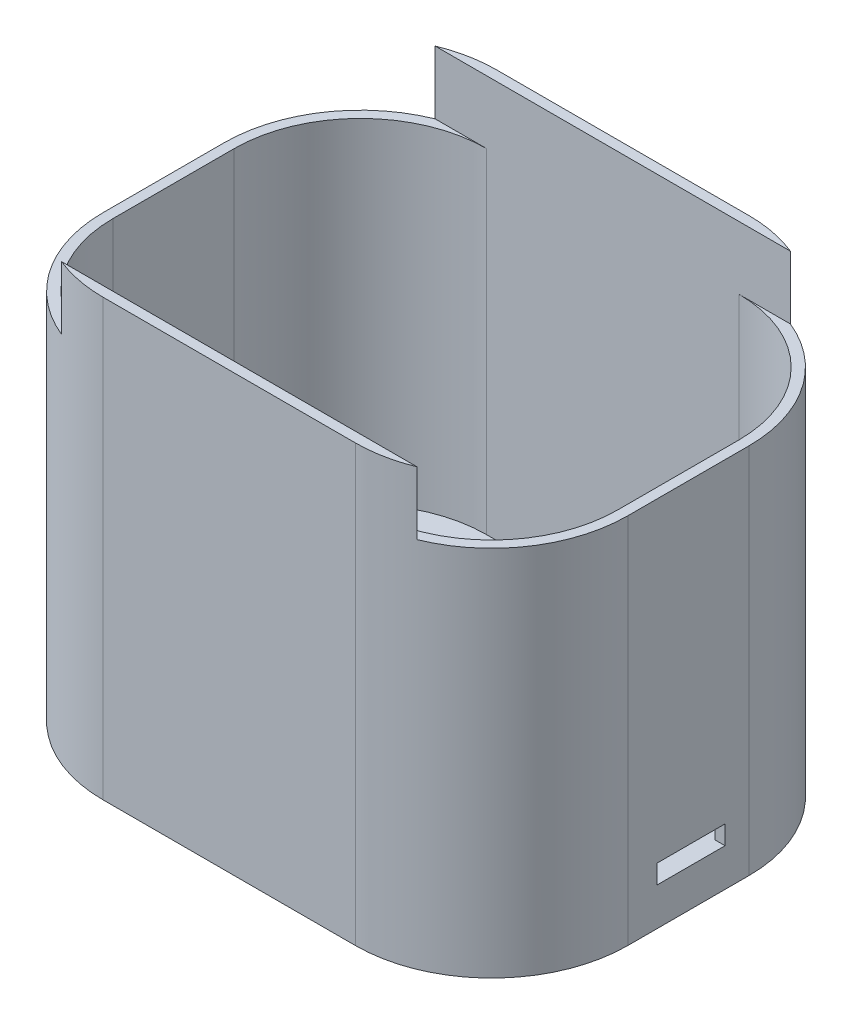
ISO-10303-21;
HEADER;
FILE_DESCRIPTION(('STEP AP214'),'2;1');
FILE_NAME('part.step','',(''),(''),'','','');
FILE_SCHEMA(('AUTOMOTIVE_DESIGN { 1 0 10303 214 1 1 1 1 }'));
ENDSEC;
DATA;
#1=APPLICATION_CONTEXT('core data for automotive mechanical design processes');
#2=APPLICATION_PROTOCOL_DEFINITION('international standard','automotive_design',2000,#1);
#3=PRODUCT_CONTEXT('',#1,'mechanical');
#4=PRODUCT('Part','Part','',(#3));
#5=PRODUCT_RELATED_PRODUCT_CATEGORY('part','',(#4));
#6=PRODUCT_DEFINITION_FORMATION('','',#4);
#7=PRODUCT_DEFINITION_CONTEXT('part definition',#1,'design');
#8=PRODUCT_DEFINITION('design','',#6,#7);
#9=PRODUCT_DEFINITION_SHAPE('','',#8);
#10=(LENGTH_UNIT() NAMED_UNIT(*) SI_UNIT(.MILLI.,.METRE.));
#11=(NAMED_UNIT(*) PLANE_ANGLE_UNIT() SI_UNIT($,.RADIAN.));
#12=(NAMED_UNIT(*) SI_UNIT($,.STERADIAN.) SOLID_ANGLE_UNIT());
#13=UNCERTAINTY_MEASURE_WITH_UNIT(LENGTH_MEASURE(1.E-05),#10,'distance_accuracy_value','');
#14=(GEOMETRIC_REPRESENTATION_CONTEXT(3) GLOBAL_UNCERTAINTY_ASSIGNED_CONTEXT((#13)) GLOBAL_UNIT_ASSIGNED_CONTEXT((#10,
#11,#12)) REPRESENTATION_CONTEXT('',''));
#15=CARTESIAN_POINT('',(0.,0.,0.));
#16=DIRECTION('',(0.,0.,1.));
#17=DIRECTION('',(1.,0.,0.));
#18=AXIS2_PLACEMENT_3D('',#15,#16,#17);
#19=CARTESIAN_POINT('',(-10.,34.5,-4.8));
#20=DIRECTION('',(0.,-1.,0.));
#21=DIRECTION('',(0.,0.,-1.));
#22=AXIS2_PLACEMENT_3D('',#19,#20,#21);
#23=CYLINDRICAL_SURFACE('',#22,10.);
#24=DIRECTION('',(0.,-1.,0.));
#25=VECTOR('',#24,1.);
#26=CARTESIAN_POINT('',(-20.,34.5,-4.8));
#27=LINE('',#26,#25);
#28=CARTESIAN_POINT('',(-20.,29.5,-4.8));
#29=VERTEX_POINT('',#28);
#30=CARTESIAN_POINT('',(-20.,3.,-4.8));
#31=VERTEX_POINT('',#30);
#32=EDGE_CURVE('E382',#29,#31,#27,.T.);
#33=ORIENTED_EDGE('',*,*,#32,.T.);
#34=CARTESIAN_POINT('',(-10.,3.,-4.8));
#35=DIRECTION('',(0.,-1.,0.));
#36=DIRECTION('',(0.,0.,-1.));
#37=AXIS2_PLACEMENT_3D('',#34,#35,#36);
#38=CIRCLE('',#37,10.);
#39=CARTESIAN_POINT('',(-10.,3.,-14.8));
#40=VERTEX_POINT('',#39);
#41=EDGE_CURVE('E296',#31,#40,#38,.T.);
#42=ORIENTED_EDGE('',*,*,#41,.T.);
#43=DIRECTION('',(0.,-1.,0.));
#44=VECTOR('',#43,1.);
#45=CARTESIAN_POINT('',(-10.,34.5,-14.8));
#46=LINE('',#45,#44);
#47=CARTESIAN_POINT('',(-10.,29.5,-14.8));
#48=VERTEX_POINT('',#47);
#49=EDGE_CURVE('E361',#48,#40,#46,.T.);
#50=ORIENTED_EDGE('',*,*,#49,.F.);
#51=CARTESIAN_POINT('',(-10.,29.5,-4.8));
#52=DIRECTION('',(0.,-1.,0.));
#53=DIRECTION('',(0.,0.,-1.));
#54=AXIS2_PLACEMENT_3D('',#51,#52,#53);
#55=CIRCLE('',#54,10.);
#56=EDGE_CURVE('E331',#29,#48,#55,.T.);
#57=ORIENTED_EDGE('',*,*,#56,.F.);
#58=EDGE_LOOP('',(#33,#42,#50,#57));
#59=FACE_BOUND('',#58,.T.);
#60=ADVANCED_FACE('F37',(#59),#23,.F.);
#61=CARTESIAN_POINT('',(-20.,34.5,4.8));
#62=DIRECTION('',(1.,0.,0.));
#63=DIRECTION('',(0.,0.,-1.));
#64=AXIS2_PLACEMENT_3D('',#61,#62,#63);
#65=PLANE('',#64);
#66=DIRECTION('',(0.,1.,0.));
#67=VECTOR('',#66,1.);
#68=CARTESIAN_POINT('',(-20.,34.5,-2.89999999999999));
#69=LINE('',#68,#67);
#70=CARTESIAN_POINT('',(-20.,3.,-2.89999999999999));
#71=VERTEX_POINT('',#70);
#72=CARTESIAN_POINT('',(-20.,4.5,-2.90000000000001));
#73=VERTEX_POINT('',#72);
#74=EDGE_CURVE('E228',#71,#73,#69,.T.);
#75=ORIENTED_EDGE('',*,*,#74,.F.);
#76=DIRECTION('',(0.,0.,-1.));
#77=VECTOR('',#76,1.);
#78=CARTESIAN_POINT('',(-20.,3.,-4.8));
#79=LINE('',#78,#77);
#80=EDGE_CURVE('E292',#71,#31,#79,.T.);
#81=ORIENTED_EDGE('',*,*,#80,.T.);
#82=ORIENTED_EDGE('',*,*,#32,.F.);
#83=DIRECTION('',(0.,0.,-1.));
#84=VECTOR('',#83,1.);
#85=CARTESIAN_POINT('',(-20.,29.5,4.8));
#86=LINE('',#85,#84);
#87=CARTESIAN_POINT('',(-20.,29.5,4.8));
#88=VERTEX_POINT('',#87);
#89=EDGE_CURVE('E329',#88,#29,#86,.T.);
#90=ORIENTED_EDGE('',*,*,#89,.F.);
#91=DIRECTION('',(0.,-1.,0.));
#92=VECTOR('',#91,1.);
#93=CARTESIAN_POINT('',(-20.,34.5,4.8));
#94=LINE('',#93,#92);
#95=CARTESIAN_POINT('',(-20.,3.,4.8));
#96=VERTEX_POINT('',#95);
#97=EDGE_CURVE('E379',#88,#96,#94,.T.);
#98=ORIENTED_EDGE('',*,*,#97,.T.);
#99=CARTESIAN_POINT('',(-20.,3.,2.50000000000001));
#100=VERTEX_POINT('',#99);
#101=EDGE_CURVE('E293',#96,#100,#79,.T.);
#102=ORIENTED_EDGE('',*,*,#101,.T.);
#103=DIRECTION('',(0.,-1.,0.));
#104=VECTOR('',#103,1.);
#105=CARTESIAN_POINT('',(-20.,34.5,2.50000000000001));
#106=LINE('',#105,#104);
#107=CARTESIAN_POINT('',(-20.,4.5,2.50000000000001));
#108=VERTEX_POINT('',#107);
#109=EDGE_CURVE('E274',#108,#100,#106,.T.);
#110=ORIENTED_EDGE('',*,*,#109,.F.);
#111=DIRECTION('',(0.,0.,1.));
#112=VECTOR('',#111,1.);
#113=CARTESIAN_POINT('',(-20.,4.5,4.8));
#114=LINE('',#113,#112);
#115=EDGE_CURVE('E281',#73,#108,#114,.T.);
#116=ORIENTED_EDGE('',*,*,#115,.F.);
#117=EDGE_LOOP('',(#75,#81,#82,#90,#98,#102,#110,#116));
#118=FACE_BOUND('',#117,.T.);
#119=ADVANCED_FACE('F520',(#118),#65,.T.);
#120=CARTESIAN_POINT('',(-10.,34.5,4.8));
#121=DIRECTION('',(0.,-1.,0.));
#122=DIRECTION('',(0.,0.,-1.));
#123=AXIS2_PLACEMENT_3D('',#120,#121,#122);
#124=CYLINDRICAL_SURFACE('',#123,10.);
#125=DIRECTION('',(0.,-1.,0.));
#126=VECTOR('',#125,1.);
#127=CARTESIAN_POINT('',(-9.99999999999999,34.5,14.8));
#128=LINE('',#127,#126);
#129=CARTESIAN_POINT('',(-9.99999999999999,29.5,14.8));
#130=VERTEX_POINT('',#129);
#131=CARTESIAN_POINT('',(-9.99999999999999,3.,14.8));
#132=VERTEX_POINT('',#131);
#133=EDGE_CURVE('E376',#130,#132,#128,.T.);
#134=ORIENTED_EDGE('',*,*,#133,.T.);
#135=CARTESIAN_POINT('',(-10.,3.,4.8));
#136=DIRECTION('',(0.,-1.,0.));
#137=DIRECTION('',(0.,0.,-1.));
#138=AXIS2_PLACEMENT_3D('',#135,#136,#137);
#139=CIRCLE('',#138,10.);
#140=EDGE_CURVE('E289',#132,#96,#139,.T.);
#141=ORIENTED_EDGE('',*,*,#140,.T.);
#142=ORIENTED_EDGE('',*,*,#97,.F.);
#143=CARTESIAN_POINT('',(-10.,29.5,4.8));
#144=DIRECTION('',(0.,-1.,0.));
#145=DIRECTION('',(0.,0.,-1.));
#146=AXIS2_PLACEMENT_3D('',#143,#144,#145);
#147=CIRCLE('',#146,10.);
#148=EDGE_CURVE('E327',#130,#88,#147,.T.);
#149=ORIENTED_EDGE('',*,*,#148,.F.);
#150=EDGE_LOOP('',(#134,#141,#142,#149));
#151=FACE_BOUND('',#150,.T.);
#152=ADVANCED_FACE('F518',(#151),#124,.F.);
#153=CARTESIAN_POINT('',(-10.,34.5,14.8));
#154=DIRECTION('',(0.,0.,-1.));
#155=DIRECTION('',(-1.,0.,0.));
#156=AXIS2_PLACEMENT_3D('',#153,#154,#155);
#157=PLANE('',#156);
#158=DIRECTION('',(0.,-1.,0.));
#159=VECTOR('',#158,1.);
#160=CARTESIAN_POINT('',(10.,34.5,14.8));
#161=LINE('',#160,#159);
#162=CARTESIAN_POINT('',(10.,29.5,14.8));
#163=VERTEX_POINT('',#162);
#164=CARTESIAN_POINT('',(10.,3.,14.8));
#165=VERTEX_POINT('',#164);
#166=EDGE_CURVE('E373',#163,#165,#161,.T.);
#167=ORIENTED_EDGE('',*,*,#166,.T.);
#168=DIRECTION('',(-1.,0.,0.));
#169=VECTOR('',#168,1.);
#170=CARTESIAN_POINT('',(-9.99999999999999,3.,14.8));
#171=LINE('',#170,#169);
#172=EDGE_CURVE('E286',#165,#132,#171,.T.);
#173=ORIENTED_EDGE('',*,*,#172,.T.);
#174=ORIENTED_EDGE('',*,*,#133,.F.);
#175=DIRECTION('',(1.,0.,0.));
#176=VECTOR('',#175,1.);
#177=CARTESIAN_POINT('',(-20.8,29.5,14.8));
#178=LINE('',#177,#176);
#179=CARTESIAN_POINT('',(-14.0792156108742,29.5,14.8));
#180=VERTEX_POINT('',#179);
#181=EDGE_CURVE('E320',#180,#130,#178,.T.);
#182=ORIENTED_EDGE('',*,*,#181,.F.);
#183=DIRECTION('',(0.,-1.,0.));
#184=VECTOR('',#183,1.);
#185=CARTESIAN_POINT('',(-14.0792156108742,34.5,14.8));
#186=LINE('',#185,#184);
#187=CARTESIAN_POINT('',(-14.0792156108742,34.5,14.8));
#188=VERTEX_POINT('',#187);
#189=EDGE_CURVE('E354',#188,#180,#186,.T.);
#190=ORIENTED_EDGE('',*,*,#189,.F.);
#191=DIRECTION('',(1.,0.,0.));
#192=VECTOR('',#191,1.);
#193=CARTESIAN_POINT('',(-10.,34.5,14.8));
#194=LINE('',#193,#192);
#195=CARTESIAN_POINT('',(14.0792156108742,34.5,14.8));
#196=VERTEX_POINT('',#195);
#197=EDGE_CURVE('E357',#188,#196,#194,.T.);
#198=ORIENTED_EDGE('',*,*,#197,.T.);
#199=DIRECTION('',(0.,-1.,0.));
#200=VECTOR('',#199,1.);
#201=CARTESIAN_POINT('',(14.0792156108742,34.5,14.8));
#202=LINE('',#201,#200);
#203=CARTESIAN_POINT('',(14.0792156108742,29.5,14.8));
#204=VERTEX_POINT('',#203);
#205=EDGE_CURVE('E351',#204,#196,#202,.F.);
#206=ORIENTED_EDGE('',*,*,#205,.F.);
#207=EDGE_CURVE('E317',#163,#204,#178,.T.);
#208=ORIENTED_EDGE('',*,*,#207,.F.);
#209=EDGE_LOOP('',(#167,#173,#174,#182,#190,#198,#206,#208));
#210=FACE_BOUND('',#209,.T.);
#211=ADVANCED_FACE('F510',(#210),#157,.T.);
#212=CARTESIAN_POINT('',(10.,34.5,4.8));
#213=DIRECTION('',(0.,-1.,0.));
#214=DIRECTION('',(0.,0.,-1.));
#215=AXIS2_PLACEMENT_3D('',#212,#213,#214);
#216=CYLINDRICAL_SURFACE('',#215,10.);
#217=DIRECTION('',(0.,-1.,0.));
#218=VECTOR('',#217,1.);
#219=CARTESIAN_POINT('',(20.,34.5,4.8));
#220=LINE('',#219,#218);
#221=CARTESIAN_POINT('',(20.,29.5,4.8));
#222=VERTEX_POINT('',#221);
#223=CARTESIAN_POINT('',(20.,3.,4.8));
#224=VERTEX_POINT('',#223);
#225=EDGE_CURVE('E370',#222,#224,#220,.T.);
#226=ORIENTED_EDGE('',*,*,#225,.T.);
#227=CARTESIAN_POINT('',(10.,3.,4.8));
#228=DIRECTION('',(0.,-1.,0.));
#229=DIRECTION('',(0.,0.,-1.));
#230=AXIS2_PLACEMENT_3D('',#227,#228,#229);
#231=CIRCLE('',#230,10.);
#232=EDGE_CURVE('E283',#224,#165,#231,.T.);
#233=ORIENTED_EDGE('',*,*,#232,.T.);
#234=ORIENTED_EDGE('',*,*,#166,.F.);
#235=CARTESIAN_POINT('',(10.,29.5,4.8));
#236=DIRECTION('',(0.,-1.,0.));
#237=DIRECTION('',(0.,0.,-1.));
#238=AXIS2_PLACEMENT_3D('',#235,#236,#237);
#239=CIRCLE('',#238,10.);
#240=EDGE_CURVE('E325',#222,#163,#239,.T.);
#241=ORIENTED_EDGE('',*,*,#240,.F.);
#242=EDGE_LOOP('',(#226,#233,#234,#241));
#243=FACE_BOUND('',#242,.T.);
#244=ADVANCED_FACE('F549',(#243),#216,.F.);
#245=CARTESIAN_POINT('',(20.,34.5,4.8));
#246=DIRECTION('',(-1.,0.,0.));
#247=DIRECTION('',(0.,0.,1.));
#248=AXIS2_PLACEMENT_3D('',#245,#246,#247);
#249=PLANE('',#248);
#250=DIRECTION('',(0.,-1.,0.));
#251=VECTOR('',#250,1.);
#252=CARTESIAN_POINT('',(20.,34.5,-2.90000000000001));
#253=LINE('',#252,#251);
#254=CARTESIAN_POINT('',(20.,4.5,-2.90000000000001));
#255=VERTEX_POINT('',#254);
#256=CARTESIAN_POINT('',(20.,3.,-2.90000000000001));
#257=VERTEX_POINT('',#256);
#258=EDGE_CURVE('E276',#255,#257,#253,.T.);
#259=ORIENTED_EDGE('',*,*,#258,.F.);
#260=DIRECTION('',(0.,0.,-1.));
#261=VECTOR('',#260,1.);
#262=CARTESIAN_POINT('',(20.,4.5,4.8));
#263=LINE('',#262,#261);
#264=CARTESIAN_POINT('',(20.,4.5,2.50000000000001));
#265=VERTEX_POINT('',#264);
#266=EDGE_CURVE('E279',#265,#255,#263,.T.);
#267=ORIENTED_EDGE('',*,*,#266,.F.);
#268=DIRECTION('',(0.,1.,0.));
#269=VECTOR('',#268,1.);
#270=CARTESIAN_POINT('',(20.,34.5,2.49999999999999));
#271=LINE('',#270,#269);
#272=CARTESIAN_POINT('',(20.,3.,2.49999999999999));
#273=VERTEX_POINT('',#272);
#274=EDGE_CURVE('E266',#273,#265,#271,.T.);
#275=ORIENTED_EDGE('',*,*,#274,.F.);
#276=DIRECTION('',(0.,0.,1.));
#277=VECTOR('',#276,1.);
#278=CARTESIAN_POINT('',(20.,3.,4.8));
#279=LINE('',#278,#277);
#280=EDGE_CURVE('E305',#273,#224,#279,.T.);
#281=ORIENTED_EDGE('',*,*,#280,.T.);
#282=ORIENTED_EDGE('',*,*,#225,.F.);
#283=DIRECTION('',(0.,0.,1.));
#284=VECTOR('',#283,1.);
#285=CARTESIAN_POINT('',(20.,29.5,4.8));
#286=LINE('',#285,#284);
#287=CARTESIAN_POINT('',(20.,29.5,-4.8));
#288=VERTEX_POINT('',#287);
#289=EDGE_CURVE('E323',#288,#222,#286,.T.);
#290=ORIENTED_EDGE('',*,*,#289,.F.);
#291=DIRECTION('',(0.,-1.,0.));
#292=VECTOR('',#291,1.);
#293=CARTESIAN_POINT('',(20.,34.5,-4.8));
#294=LINE('',#293,#292);
#295=CARTESIAN_POINT('',(20.,3.,-4.8));
#296=VERTEX_POINT('',#295);
#297=EDGE_CURVE('E367',#288,#296,#294,.T.);
#298=ORIENTED_EDGE('',*,*,#297,.T.);
#299=EDGE_CURVE('E306',#296,#257,#279,.T.);
#300=ORIENTED_EDGE('',*,*,#299,.T.);
#301=EDGE_LOOP('',(#259,#267,#275,#281,#282,#290,#298,#300));
#302=FACE_BOUND('',#301,.T.);
#303=ADVANCED_FACE('F543',(#302),#249,.T.);
#304=CARTESIAN_POINT('',(10.,34.5,-4.8));
#305=DIRECTION('',(0.,-1.,0.));
#306=DIRECTION('',(0.,0.,-1.));
#307=AXIS2_PLACEMENT_3D('',#304,#305,#306);
#308=CYLINDRICAL_SURFACE('',#307,10.);
#309=DIRECTION('',(0.,-1.,0.));
#310=VECTOR('',#309,1.);
#311=CARTESIAN_POINT('',(10.,34.5,-14.8));
#312=LINE('',#311,#310);
#313=CARTESIAN_POINT('',(10.,29.5,-14.8));
#314=VERTEX_POINT('',#313);
#315=CARTESIAN_POINT('',(10.,3.,-14.8));
#316=VERTEX_POINT('',#315);
#317=EDGE_CURVE('E364',#314,#316,#312,.T.);
#318=ORIENTED_EDGE('',*,*,#317,.T.);
#319=CARTESIAN_POINT('',(10.,3.,-4.8));
#320=DIRECTION('',(0.,-1.,0.));
#321=DIRECTION('',(0.,0.,-1.));
#322=AXIS2_PLACEMENT_3D('',#319,#320,#321);
#323=CIRCLE('',#322,10.);
#324=EDGE_CURVE('E302',#316,#296,#323,.T.);
#325=ORIENTED_EDGE('',*,*,#324,.T.);
#326=ORIENTED_EDGE('',*,*,#297,.F.);
#327=CARTESIAN_POINT('',(10.,29.5,-4.8));
#328=DIRECTION('',(0.,-1.,0.));
#329=DIRECTION('',(0.,0.,-1.));
#330=AXIS2_PLACEMENT_3D('',#327,#328,#329);
#331=CIRCLE('',#330,10.);
#332=EDGE_CURVE('E321',#314,#288,#331,.T.);
#333=ORIENTED_EDGE('',*,*,#332,.F.);
#334=EDGE_LOOP('',(#318,#325,#326,#333));
#335=FACE_BOUND('',#334,.T.);
#336=ADVANCED_FACE('F540',(#335),#308,.F.);
#337=CARTESIAN_POINT('',(-10.,34.5,-14.8));
#338=DIRECTION('',(0.,0.,1.));
#339=DIRECTION('',(1.,0.,0.));
#340=AXIS2_PLACEMENT_3D('',#337,#338,#339);
#341=PLANE('',#340);
#342=ORIENTED_EDGE('',*,*,#49,.T.);
#343=DIRECTION('',(1.,0.,0.));
#344=VECTOR('',#343,1.);
#345=CARTESIAN_POINT('',(10.,3.,-14.8));
#346=LINE('',#345,#344);
#347=EDGE_CURVE('E299',#40,#316,#346,.T.);
#348=ORIENTED_EDGE('',*,*,#347,.T.);
#349=ORIENTED_EDGE('',*,*,#317,.F.);
#350=DIRECTION('',(-1.,0.,0.));
#351=VECTOR('',#350,1.);
#352=CARTESIAN_POINT('',(-20.8,29.5,-14.8));
#353=LINE('',#352,#351);
#354=CARTESIAN_POINT('',(14.0792156108742,29.5,-14.8));
#355=VERTEX_POINT('',#354);
#356=EDGE_CURVE('E314',#355,#314,#353,.T.);
#357=ORIENTED_EDGE('',*,*,#356,.F.);
#358=DIRECTION('',(0.,-1.,0.));
#359=VECTOR('',#358,1.);
#360=CARTESIAN_POINT('',(14.0792156108742,34.5,-14.8));
#361=LINE('',#360,#359);
#362=CARTESIAN_POINT('',(14.0792156108742,34.5,-14.8));
#363=VERTEX_POINT('',#362);
#364=EDGE_CURVE('E348',#363,#355,#361,.T.);
#365=ORIENTED_EDGE('',*,*,#364,.F.);
#366=DIRECTION('',(-1.,0.,0.));
#367=VECTOR('',#366,1.);
#368=CARTESIAN_POINT('',(-10.,34.5,-14.8));
#369=LINE('',#368,#367);
#370=CARTESIAN_POINT('',(-14.0792156108742,34.5,-14.8));
#371=VERTEX_POINT('',#370);
#372=EDGE_CURVE('E359',#363,#371,#369,.T.);
#373=ORIENTED_EDGE('',*,*,#372,.T.);
#374=DIRECTION('',(0.,-1.,0.));
#375=VECTOR('',#374,1.);
#376=CARTESIAN_POINT('',(-14.0792156108742,34.5,-14.8));
#377=LINE('',#376,#375);
#378=CARTESIAN_POINT('',(-14.0792156108742,29.5,-14.8));
#379=VERTEX_POINT('',#378);
#380=EDGE_CURVE('E345',#379,#371,#377,.F.);
#381=ORIENTED_EDGE('',*,*,#380,.F.);
#382=EDGE_CURVE('E311',#48,#379,#353,.T.);
#383=ORIENTED_EDGE('',*,*,#382,.F.);
#384=EDGE_LOOP('',(#342,#348,#349,#357,#365,#373,#381,#383));
#385=FACE_BOUND('',#384,.T.);
#386=ADVANCED_FACE('F529',(#385),#341,.T.);
#387=CARTESIAN_POINT('',(-10.,34.5,4.8));
#388=DIRECTION('',(0.,-1.,0.));
#389=DIRECTION('',(0.,0.,-1.));
#390=AXIS2_PLACEMENT_3D('',#387,#388,#389);
#391=PLANE('',#390);
#392=CARTESIAN_POINT('',(10.,34.5,4.8));
#393=DIRECTION('',(0.,1.,0.));
#394=DIRECTION('',(0.,0.,-1.));
#395=AXIS2_PLACEMENT_3D('',#392,#393,#394);
#396=CIRCLE('',#395,10.8);
#397=CARTESIAN_POINT('',(10.,34.5,15.6));
#398=VERTEX_POINT('',#397);
#399=EDGE_CURVE('E391',#398,#196,#396,.T.);
#400=ORIENTED_EDGE('',*,*,#399,.T.);
#401=ORIENTED_EDGE('',*,*,#197,.F.);
#402=CARTESIAN_POINT('',(-10.,34.5,4.8));
#403=DIRECTION('',(0.,1.,0.));
#404=DIRECTION('',(0.,0.,-1.));
#405=AXIS2_PLACEMENT_3D('',#402,#403,#404);
#406=CIRCLE('',#405,10.8);
#407=CARTESIAN_POINT('',(-10.,34.5,15.6));
#408=VERTEX_POINT('',#407);
#409=EDGE_CURVE('E386',#188,#408,#406,.T.);
#410=ORIENTED_EDGE('',*,*,#409,.T.);
#411=DIRECTION('',(1.,0.,0.));
#412=VECTOR('',#411,1.);
#413=CARTESIAN_POINT('',(-10.,34.5,15.6));
#414=LINE('',#413,#412);
#415=EDGE_CURVE('E388',#408,#398,#414,.T.);
#416=ORIENTED_EDGE('',*,*,#415,.T.);
#417=EDGE_LOOP('',(#400,#401,#410,#416));
#418=FACE_BOUND('',#417,.T.);
#419=ADVANCED_FACE('F506',(#418),#391,.F.);
#420=CARTESIAN_POINT('',(-10.,34.5,-4.8));
#421=DIRECTION('',(0.,1.,0.));
#422=DIRECTION('',(0.,0.,-1.));
#423=AXIS2_PLACEMENT_3D('',#420,#421,#422);
#424=CIRCLE('',#423,10.8);
#425=CARTESIAN_POINT('',(-10.,34.5,-15.6));
#426=VERTEX_POINT('',#425);
#427=EDGE_CURVE('E398',#426,#371,#424,.T.);
#428=ORIENTED_EDGE('',*,*,#427,.T.);
#429=ORIENTED_EDGE('',*,*,#372,.F.);
#430=CARTESIAN_POINT('',(10.,34.5,-4.8));
#431=DIRECTION('',(0.,1.,0.));
#432=DIRECTION('',(0.,0.,-1.));
#433=AXIS2_PLACEMENT_3D('',#430,#431,#432);
#434=CIRCLE('',#433,10.8);
#435=CARTESIAN_POINT('',(10.,34.5,-15.6));
#436=VERTEX_POINT('',#435);
#437=EDGE_CURVE('E394',#363,#436,#434,.T.);
#438=ORIENTED_EDGE('',*,*,#437,.T.);
#439=DIRECTION('',(-1.,0.,0.));
#440=VECTOR('',#439,1.);
#441=CARTESIAN_POINT('',(-10.,34.5,-15.6));
#442=LINE('',#441,#440);
#443=EDGE_CURVE('E396',#436,#426,#442,.T.);
#444=ORIENTED_EDGE('',*,*,#443,.T.);
#445=EDGE_LOOP('',(#428,#429,#438,#444));
#446=FACE_BOUND('',#445,.T.);
#447=ADVANCED_FACE('F466',(#446),#391,.F.);
#448=CARTESIAN_POINT('',(-10.,0.,4.8));
#449=DIRECTION('',(0.,-1.,0.));
#450=DIRECTION('',(0.,0.,-1.));
#451=AXIS2_PLACEMENT_3D('',#448,#449,#450);
#452=PLANE('',#451);
#453=CARTESIAN_POINT('',(-8.,0.,0.));
#454=DIRECTION('',(0.,-1.,0.));
#455=DIRECTION('',(0.,0.,-1.));
#456=AXIS2_PLACEMENT_3D('',#453,#454,#455);
#457=CIRCLE('',#456,1.68);
#458=CARTESIAN_POINT('',(-8.,0.,-1.68));
#459=VERTEX_POINT('',#458);
#460=EDGE_CURVE('E793',#459,#459,#457,.T.);
#461=ORIENTED_EDGE('',*,*,#460,.F.);
#462=EDGE_LOOP('',(#461));
#463=FACE_BOUND('',#462,.T.);
#464=CARTESIAN_POINT('',(12.,0.,0.));
#465=DIRECTION('',(0.,-1.,0.));
#466=DIRECTION('',(0.,0.,-1.));
#467=AXIS2_PLACEMENT_3D('',#464,#465,#466);
#468=CIRCLE('',#467,0.85);
#469=CARTESIAN_POINT('',(12.,0.,-0.85));
#470=VERTEX_POINT('',#469);
#471=EDGE_CURVE('E795',#470,#470,#468,.T.);
#472=ORIENTED_EDGE('',*,*,#471,.F.);
#473=EDGE_LOOP('',(#472));
#474=FACE_BOUND('',#473,.T.);
#475=CARTESIAN_POINT('',(-12.,0.,0.));
#476=DIRECTION('',(0.,-1.,0.));
#477=DIRECTION('',(0.,0.,-1.));
#478=AXIS2_PLACEMENT_3D('',#475,#476,#477);
#479=CIRCLE('',#478,0.949999999999999);
#480=CARTESIAN_POINT('',(-12.,0.,-0.949999999999999));
#481=VERTEX_POINT('',#480);
#482=EDGE_CURVE('E801',#481,#481,#479,.T.);
#483=ORIENTED_EDGE('',*,*,#482,.F.);
#484=EDGE_LOOP('',(#483));
#485=FACE_BOUND('',#484,.T.);
#486=CARTESIAN_POINT('',(4.,0.,0.));
#487=DIRECTION('',(0.,-1.,0.));
#488=DIRECTION('',(0.,0.,-1.));
#489=AXIS2_PLACEMENT_3D('',#486,#487,#488);
#490=CIRCLE('',#489,0.91);
#491=CARTESIAN_POINT('',(4.,0.,-0.91));
#492=VERTEX_POINT('',#491);
#493=EDGE_CURVE('E442',#492,#492,#490,.T.);
#494=ORIENTED_EDGE('',*,*,#493,.F.);
#495=EDGE_LOOP('',(#494));
#496=FACE_BOUND('',#495,.T.);
#497=CARTESIAN_POINT('',(8.,0.,0.));
#498=DIRECTION('',(0.,-1.,0.));
#499=DIRECTION('',(0.,0.,-1.));
#500=AXIS2_PLACEMENT_3D('',#497,#498,#499);
#501=CIRCLE('',#500,1.3);
#502=CARTESIAN_POINT('',(8.,0.,-1.3));
#503=VERTEX_POINT('',#502);
#504=EDGE_CURVE('E798',#503,#503,#501,.T.);
#505=ORIENTED_EDGE('',*,*,#504,.F.);
#506=EDGE_LOOP('',(#505));
#507=FACE_BOUND('',#506,.T.);
#508=CARTESIAN_POINT('',(-4.,0.,0.));
#509=DIRECTION('',(0.,-1.,0.));
#510=DIRECTION('',(0.,0.,-1.));
#511=AXIS2_PLACEMENT_3D('',#508,#509,#510);
#512=CIRCLE('',#511,0.91);
#513=CARTESIAN_POINT('',(-4.,0.,-0.91));
#514=VERTEX_POINT('',#513);
#515=EDGE_CURVE('E794',#514,#514,#512,.T.);
#516=ORIENTED_EDGE('',*,*,#515,.F.);
#517=EDGE_LOOP('',(#516));
#518=FACE_BOUND('',#517,.T.);
#519=CARTESIAN_POINT('',(0.,0.,0.));
#520=DIRECTION('',(0.,-1.,0.));
#521=DIRECTION('',(0.,0.,-1.));
#522=AXIS2_PLACEMENT_3D('',#519,#520,#521);
#523=CIRCLE('',#522,1.22);
#524=CARTESIAN_POINT('',(0.,0.,-1.22));
#525=VERTEX_POINT('',#524);
#526=EDGE_CURVE('E252',#525,#525,#523,.T.);
#527=ORIENTED_EDGE('',*,*,#526,.F.);
#528=EDGE_LOOP('',(#527));
#529=FACE_BOUND('',#528,.T.);
#530=CARTESIAN_POINT('',(-10.,0.,4.8));
#531=DIRECTION('',(0.,1.,0.));
#532=DIRECTION('',(0.,0.,-1.));
#533=AXIS2_PLACEMENT_3D('',#530,#531,#532);
#534=CIRCLE('',#533,10.8);
#535=CARTESIAN_POINT('',(-20.8,0.,4.8));
#536=VERTEX_POINT('',#535);
#537=CARTESIAN_POINT('',(-10.,0.,15.6));
#538=VERTEX_POINT('',#537);
#539=EDGE_CURVE('E385',#536,#538,#534,.T.);
#540=ORIENTED_EDGE('',*,*,#539,.F.);
#541=DIRECTION('',(0.,0.,1.));
#542=VECTOR('',#541,1.);
#543=CARTESIAN_POINT('',(-20.8,0.,4.8));
#544=LINE('',#543,#542);
#545=CARTESIAN_POINT('',(-20.8,0.,-4.8));
#546=VERTEX_POINT('',#545);
#547=EDGE_CURVE('E389',#546,#536,#544,.T.);
#548=ORIENTED_EDGE('',*,*,#547,.F.);
#549=CARTESIAN_POINT('',(-10.,0.,-4.8));
#550=DIRECTION('',(0.,1.,0.));
#551=DIRECTION('',(0.,0.,-1.));
#552=AXIS2_PLACEMENT_3D('',#549,#550,#551);
#553=CIRCLE('',#552,10.8);
#554=CARTESIAN_POINT('',(-10.,0.,-15.6));
#555=VERTEX_POINT('',#554);
#556=EDGE_CURVE('E416',#555,#546,#553,.T.);
#557=ORIENTED_EDGE('',*,*,#556,.F.);
#558=DIRECTION('',(-1.,0.,0.));
#559=VECTOR('',#558,1.);
#560=CARTESIAN_POINT('',(-10.,0.,-15.6));
#561=LINE('',#560,#559);
#562=CARTESIAN_POINT('',(10.,0.,-15.6));
#563=VERTEX_POINT('',#562);
#564=EDGE_CURVE('E414',#563,#555,#561,.T.);
#565=ORIENTED_EDGE('',*,*,#564,.F.);
#566=CARTESIAN_POINT('',(10.,0.,-4.8));
#567=DIRECTION('',(0.,1.,0.));
#568=DIRECTION('',(0.,0.,-1.));
#569=AXIS2_PLACEMENT_3D('',#566,#567,#568);
#570=CIRCLE('',#569,10.8);
#571=CARTESIAN_POINT('',(20.8,0.,-4.8));
#572=VERTEX_POINT('',#571);
#573=EDGE_CURVE('E412',#572,#563,#570,.T.);
#574=ORIENTED_EDGE('',*,*,#573,.F.);
#575=DIRECTION('',(0.,0.,-1.));
#576=VECTOR('',#575,1.);
#577=CARTESIAN_POINT('',(20.8,0.,4.8));
#578=LINE('',#577,#576);
#579=CARTESIAN_POINT('',(20.8,0.,4.8));
#580=VERTEX_POINT('',#579);
#581=EDGE_CURVE('E409',#580,#572,#578,.T.);
#582=ORIENTED_EDGE('',*,*,#581,.F.);
#583=CARTESIAN_POINT('',(10.,0.,4.8));
#584=DIRECTION('',(0.,1.,0.));
#585=DIRECTION('',(0.,0.,-1.));
#586=AXIS2_PLACEMENT_3D('',#583,#584,#585);
#587=CIRCLE('',#586,10.8);
#588=CARTESIAN_POINT('',(10.,0.,15.6));
#589=VERTEX_POINT('',#588);
#590=EDGE_CURVE('E406',#589,#580,#587,.T.);
#591=ORIENTED_EDGE('',*,*,#590,.F.);
#592=DIRECTION('',(1.,0.,0.));
#593=VECTOR('',#592,1.);
#594=CARTESIAN_POINT('',(-10.,0.,15.6));
#595=LINE('',#594,#593);
#596=EDGE_CURVE('E404',#538,#589,#595,.T.);
#597=ORIENTED_EDGE('',*,*,#596,.F.);
#598=EDGE_LOOP('',(#540,#548,#557,#565,#574,#582,#591,#597));
#599=FACE_BOUND('',#598,.T.);
#600=ADVANCED_FACE('F463',(#463,#474,#485,#496,#507,#518,#529,#599),#452,.T.);
#601=CARTESIAN_POINT('',(-10.,34.5,4.8));
#602=DIRECTION('',(0.,-1.,0.));
#603=DIRECTION('',(0.,0.,-1.));
#604=AXIS2_PLACEMENT_3D('',#601,#602,#603);
#605=CYLINDRICAL_SURFACE('',#604,10.8);
#606=ORIENTED_EDGE('',*,*,#409,.F.);
#607=ORIENTED_EDGE('',*,*,#189,.T.);
#608=CARTESIAN_POINT('',(-10.,29.5,4.8));
#609=DIRECTION('',(0.,-1.,0.));
#610=DIRECTION('',(0.,0.,-1.));
#611=AXIS2_PLACEMENT_3D('',#608,#609,#610);
#612=CIRCLE('',#611,10.8);
#613=CARTESIAN_POINT('',(-20.8,29.5,4.8));
#614=VERTEX_POINT('',#613);
#615=EDGE_CURVE('E342',#180,#614,#612,.T.);
#616=ORIENTED_EDGE('',*,*,#615,.T.);
#617=DIRECTION('',(0.,-1.,0.));
#618=VECTOR('',#617,1.);
#619=CARTESIAN_POINT('',(-20.8,34.5,4.8));
#620=LINE('',#619,#618);
#621=EDGE_CURVE('E401',#614,#536,#620,.T.);
#622=ORIENTED_EDGE('',*,*,#621,.T.);
#623=ORIENTED_EDGE('',*,*,#539,.T.);
#624=DIRECTION('',(0.,-1.,0.));
#625=VECTOR('',#624,1.);
#626=CARTESIAN_POINT('',(-10.,34.5,15.6));
#627=LINE('',#626,#625);
#628=EDGE_CURVE('E11',#408,#538,#627,.T.);
#629=ORIENTED_EDGE('',*,*,#628,.F.);
#630=EDGE_LOOP('',(#606,#607,#616,#622,#623,#629));
#631=FACE_BOUND('',#630,.T.);
#632=ADVANCED_FACE('F39',(#631),#605,.T.);
#633=CARTESIAN_POINT('',(-10.,34.5,15.6));
#634=DIRECTION('',(0.,0.,-1.));
#635=DIRECTION('',(-1.,0.,0.));
#636=AXIS2_PLACEMENT_3D('',#633,#634,#635);
#637=PLANE('',#636);
#638=ORIENTED_EDGE('',*,*,#596,.T.);
#639=DIRECTION('',(0.,-1.,0.));
#640=VECTOR('',#639,1.);
#641=CARTESIAN_POINT('',(10.,34.5,15.6));
#642=LINE('',#641,#640);
#643=EDGE_CURVE('E46',#398,#589,#642,.T.);
#644=ORIENTED_EDGE('',*,*,#643,.F.);
#645=ORIENTED_EDGE('',*,*,#415,.F.);
#646=ORIENTED_EDGE('',*,*,#628,.T.);
#647=EDGE_LOOP('',(#638,#644,#645,#646));
#648=FACE_BOUND('',#647,.T.);
#649=ADVANCED_FACE('F504',(#648),#637,.F.);
#650=CARTESIAN_POINT('',(10.,34.5,4.8));
#651=DIRECTION('',(0.,-1.,0.));
#652=DIRECTION('',(0.,0.,-1.));
#653=AXIS2_PLACEMENT_3D('',#650,#651,#652);
#654=CYLINDRICAL_SURFACE('',#653,10.8);
#655=CARTESIAN_POINT('',(10.,29.5,4.8));
#656=DIRECTION('',(0.,-1.,0.));
#657=DIRECTION('',(0.,0.,-1.));
#658=AXIS2_PLACEMENT_3D('',#655,#656,#657);
#659=CIRCLE('',#658,10.8);
#660=CARTESIAN_POINT('',(20.8,29.5,4.8));
#661=VERTEX_POINT('',#660);
#662=EDGE_CURVE('E339',#661,#204,#659,.T.);
#663=ORIENTED_EDGE('',*,*,#662,.T.);
#664=ORIENTED_EDGE('',*,*,#205,.T.);
#665=ORIENTED_EDGE('',*,*,#399,.F.);
#666=ORIENTED_EDGE('',*,*,#643,.T.);
#667=ORIENTED_EDGE('',*,*,#590,.T.);
#668=DIRECTION('',(0.,-1.,0.));
#669=VECTOR('',#668,1.);
#670=CARTESIAN_POINT('',(20.8,34.5,4.8));
#671=LINE('',#670,#669);
#672=EDGE_CURVE('E432',#661,#580,#671,.T.);
#673=ORIENTED_EDGE('',*,*,#672,.F.);
#674=EDGE_LOOP('',(#663,#664,#665,#666,#667,#673));
#675=FACE_BOUND('',#674,.T.);
#676=ADVANCED_FACE('F499',(#675),#654,.T.);
#677=CARTESIAN_POINT('',(20.8,34.5,4.8));
#678=DIRECTION('',(-1.,0.,0.));
#679=DIRECTION('',(0.,0.,1.));
#680=AXIS2_PLACEMENT_3D('',#677,#678,#679);
#681=PLANE('',#680);
#682=DIRECTION('',(0.,0.,1.));
#683=VECTOR('',#682,1.);
#684=CARTESIAN_POINT('',(20.8,4.5,2.49999999999999));
#685=LINE('',#684,#683);
#686=CARTESIAN_POINT('',(20.8,4.5,-2.90000000000001));
#687=VERTEX_POINT('',#686);
#688=CARTESIAN_POINT('',(20.8,4.5,2.49999999999999));
#689=VERTEX_POINT('',#688);
#690=EDGE_CURVE('E259',#687,#689,#685,.T.);
#691=ORIENTED_EDGE('',*,*,#690,.F.);
#692=DIRECTION('',(0.,1.,0.));
#693=VECTOR('',#692,1.);
#694=CARTESIAN_POINT('',(20.8,4.5,-2.90000000000001));
#695=LINE('',#694,#693);
#696=CARTESIAN_POINT('',(20.8,3.,-2.90000000000001));
#697=VERTEX_POINT('',#696);
#698=EDGE_CURVE('E257',#697,#687,#695,.T.);
#699=ORIENTED_EDGE('',*,*,#698,.F.);
#700=DIRECTION('',(0.,0.,-1.));
#701=VECTOR('',#700,1.);
#702=CARTESIAN_POINT('',(20.8,3.,2.49999999999999));
#703=LINE('',#702,#701);
#704=CARTESIAN_POINT('',(20.8,3.,2.49999999999999));
#705=VERTEX_POINT('',#704);
#706=EDGE_CURVE('E246',#705,#697,#703,.T.);
#707=ORIENTED_EDGE('',*,*,#706,.F.);
#708=DIRECTION('',(0.,-1.,0.));
#709=VECTOR('',#708,1.);
#710=CARTESIAN_POINT('',(20.8,3.,2.49999999999999));
#711=LINE('',#710,#709);
#712=EDGE_CURVE('E249',#689,#705,#711,.T.);
#713=ORIENTED_EDGE('',*,*,#712,.F.);
#714=EDGE_LOOP('',(#691,#699,#707,#713));
#715=FACE_BOUND('',#714,.T.);
#716=DIRECTION('',(0.,-1.,0.));
#717=VECTOR('',#716,1.);
#718=CARTESIAN_POINT('',(20.8,34.5,-4.8));
#719=LINE('',#718,#717);
#720=CARTESIAN_POINT('',(20.8,29.5,-4.8));
#721=VERTEX_POINT('',#720);
#722=EDGE_CURVE('E430',#721,#572,#719,.T.);
#723=ORIENTED_EDGE('',*,*,#722,.F.);
#724=DIRECTION('',(0.,0.,-1.));
#725=VECTOR('',#724,1.);
#726=CARTESIAN_POINT('',(20.8,29.5,14.8));
#727=LINE('',#726,#725);
#728=EDGE_CURVE('E309',#661,#721,#727,.T.);
#729=ORIENTED_EDGE('',*,*,#728,.F.);
#730=ORIENTED_EDGE('',*,*,#672,.T.);
#731=ORIENTED_EDGE('',*,*,#581,.T.);
#732=EDGE_LOOP('',(#723,#729,#730,#731));
#733=FACE_BOUND('',#732,.T.);
#734=ADVANCED_FACE('F496',(#715,#733),#681,.F.);
#735=CARTESIAN_POINT('',(10.,34.5,-4.8));
#736=DIRECTION('',(0.,-1.,0.));
#737=DIRECTION('',(0.,0.,-1.));
#738=AXIS2_PLACEMENT_3D('',#735,#736,#737);
#739=CYLINDRICAL_SURFACE('',#738,10.8);
#740=ORIENTED_EDGE('',*,*,#437,.F.);
#741=ORIENTED_EDGE('',*,*,#364,.T.);
#742=CARTESIAN_POINT('',(10.,29.5,-4.8));
#743=DIRECTION('',(0.,-1.,0.));
#744=DIRECTION('',(0.,0.,-1.));
#745=AXIS2_PLACEMENT_3D('',#742,#743,#744);
#746=CIRCLE('',#745,10.8);
#747=EDGE_CURVE('E336',#355,#721,#746,.T.);
#748=ORIENTED_EDGE('',*,*,#747,.T.);
#749=ORIENTED_EDGE('',*,*,#722,.T.);
#750=ORIENTED_EDGE('',*,*,#573,.T.);
#751=DIRECTION('',(0.,-1.,0.));
#752=VECTOR('',#751,1.);
#753=CARTESIAN_POINT('',(10.,34.5,-15.6));
#754=LINE('',#753,#752);
#755=EDGE_CURVE('E427',#436,#563,#754,.T.);
#756=ORIENTED_EDGE('',*,*,#755,.F.);
#757=EDGE_LOOP('',(#740,#741,#748,#749,#750,#756));
#758=FACE_BOUND('',#757,.T.);
#759=ADVANCED_FACE('F492',(#758),#739,.T.);
#760=CARTESIAN_POINT('',(-10.,34.5,-15.6));
#761=DIRECTION('',(0.,0.,1.));
#762=DIRECTION('',(1.,0.,0.));
#763=AXIS2_PLACEMENT_3D('',#760,#761,#762);
#764=PLANE('',#763);
#765=ORIENTED_EDGE('',*,*,#564,.T.);
#766=DIRECTION('',(0.,-1.,0.));
#767=VECTOR('',#766,1.);
#768=CARTESIAN_POINT('',(-10.,34.5,-15.6));
#769=LINE('',#768,#767);
#770=EDGE_CURVE('E424',#426,#555,#769,.T.);
#771=ORIENTED_EDGE('',*,*,#770,.F.);
#772=ORIENTED_EDGE('',*,*,#443,.F.);
#773=ORIENTED_EDGE('',*,*,#755,.T.);
#774=EDGE_LOOP('',(#765,#771,#772,#773));
#775=FACE_BOUND('',#774,.T.);
#776=ADVANCED_FACE('F487',(#775),#764,.F.);
#777=CARTESIAN_POINT('',(-10.,34.5,-4.8));
#778=DIRECTION('',(0.,-1.,0.));
#779=DIRECTION('',(0.,0.,-1.));
#780=AXIS2_PLACEMENT_3D('',#777,#778,#779);
#781=CYLINDRICAL_SURFACE('',#780,10.8);
#782=CARTESIAN_POINT('',(-10.,29.5,-4.8));
#783=DIRECTION('',(0.,-1.,0.));
#784=DIRECTION('',(0.,0.,-1.));
#785=AXIS2_PLACEMENT_3D('',#782,#783,#784);
#786=CIRCLE('',#785,10.8);
#787=CARTESIAN_POINT('',(-20.8,29.5,-4.8));
#788=VERTEX_POINT('',#787);
#789=EDGE_CURVE('E333',#788,#379,#786,.T.);
#790=ORIENTED_EDGE('',*,*,#789,.T.);
#791=ORIENTED_EDGE('',*,*,#380,.T.);
#792=ORIENTED_EDGE('',*,*,#427,.F.);
#793=ORIENTED_EDGE('',*,*,#770,.T.);
#794=ORIENTED_EDGE('',*,*,#556,.T.);
#795=DIRECTION('',(0.,-1.,0.));
#796=VECTOR('',#795,1.);
#797=CARTESIAN_POINT('',(-20.8,34.5,-4.8));
#798=LINE('',#797,#796);
#799=EDGE_CURVE('E422',#788,#546,#798,.T.);
#800=ORIENTED_EDGE('',*,*,#799,.F.);
#801=EDGE_LOOP('',(#790,#791,#792,#793,#794,#800));
#802=FACE_BOUND('',#801,.T.);
#803=ADVANCED_FACE('F480',(#802),#781,.T.);
#804=CARTESIAN_POINT('',(-20.8,34.5,4.8));
#805=DIRECTION('',(1.,0.,0.));
#806=DIRECTION('',(0.,0.,-1.));
#807=AXIS2_PLACEMENT_3D('',#804,#805,#806);
#808=PLANE('',#807);
#809=DIRECTION('',(0.,0.,-1.));
#810=VECTOR('',#809,1.);
#811=CARTESIAN_POINT('',(-20.8,3.,2.50000000000001));
#812=LINE('',#811,#810);
#813=CARTESIAN_POINT('',(-20.8,3.,2.50000000000001));
#814=VERTEX_POINT('',#813);
#815=CARTESIAN_POINT('',(-20.8,3.,-2.89999999999999));
#816=VERTEX_POINT('',#815);
#817=EDGE_CURVE('E245',#814,#816,#812,.T.);
#818=ORIENTED_EDGE('',*,*,#817,.T.);
#819=DIRECTION('',(0.,1.,0.));
#820=VECTOR('',#819,1.);
#821=CARTESIAN_POINT('',(-20.8,4.5,-2.89999999999999));
#822=LINE('',#821,#820);
#823=CARTESIAN_POINT('',(-20.8,4.5,-2.89999999999999));
#824=VERTEX_POINT('',#823);
#825=EDGE_CURVE('E225',#816,#824,#822,.T.);
#826=ORIENTED_EDGE('',*,*,#825,.T.);
#827=DIRECTION('',(0.,0.,1.));
#828=VECTOR('',#827,1.);
#829=CARTESIAN_POINT('',(-20.8,4.5,2.50000000000001));
#830=LINE('',#829,#828);
#831=CARTESIAN_POINT('',(-20.8,4.5,2.50000000000001));
#832=VERTEX_POINT('',#831);
#833=EDGE_CURVE('E234',#824,#832,#830,.T.);
#834=ORIENTED_EDGE('',*,*,#833,.T.);
#835=DIRECTION('',(0.,-1.,0.));
#836=VECTOR('',#835,1.);
#837=CARTESIAN_POINT('',(-20.8,3.,2.50000000000001));
#838=LINE('',#837,#836);
#839=EDGE_CURVE('E240',#832,#814,#838,.T.);
#840=ORIENTED_EDGE('',*,*,#839,.T.);
#841=EDGE_LOOP('',(#818,#826,#834,#840));
#842=FACE_BOUND('',#841,.T.);
#843=ORIENTED_EDGE('',*,*,#621,.F.);
#844=DIRECTION('',(0.,0.,1.));
#845=VECTOR('',#844,1.);
#846=CARTESIAN_POINT('',(-20.8,29.5,14.8));
#847=LINE('',#846,#845);
#848=EDGE_CURVE('E315',#788,#614,#847,.T.);
#849=ORIENTED_EDGE('',*,*,#848,.F.);
#850=ORIENTED_EDGE('',*,*,#799,.T.);
#851=ORIENTED_EDGE('',*,*,#547,.T.);
#852=EDGE_LOOP('',(#843,#849,#850,#851));
#853=FACE_BOUND('',#852,.T.);
#854=ADVANCED_FACE('F242',(#842,#853),#808,.F.);
#855=CARTESIAN_POINT('',(0.,29.5,0.));
#856=DIRECTION('',(0.,-1.,0.));
#857=DIRECTION('',(0.,0.,-1.));
#858=AXIS2_PLACEMENT_3D('',#855,#856,#857);
#859=PLANE('',#858);
#860=ORIENTED_EDGE('',*,*,#728,.T.);
#861=ORIENTED_EDGE('',*,*,#747,.F.);
#862=ORIENTED_EDGE('',*,*,#356,.T.);
#863=ORIENTED_EDGE('',*,*,#332,.T.);
#864=ORIENTED_EDGE('',*,*,#289,.T.);
#865=ORIENTED_EDGE('',*,*,#240,.T.);
#866=ORIENTED_EDGE('',*,*,#207,.T.);
#867=ORIENTED_EDGE('',*,*,#662,.F.);
#868=EDGE_LOOP('',(#860,#861,#862,#863,#864,#865,#866,#867));
#869=FACE_BOUND('',#868,.T.);
#870=ADVANCED_FACE('F536',(#869),#859,.F.);
#871=ORIENTED_EDGE('',*,*,#181,.T.);
#872=ORIENTED_EDGE('',*,*,#148,.T.);
#873=ORIENTED_EDGE('',*,*,#89,.T.);
#874=ORIENTED_EDGE('',*,*,#56,.T.);
#875=ORIENTED_EDGE('',*,*,#382,.T.);
#876=ORIENTED_EDGE('',*,*,#789,.F.);
#877=ORIENTED_EDGE('',*,*,#848,.T.);
#878=ORIENTED_EDGE('',*,*,#615,.F.);
#879=EDGE_LOOP('',(#871,#872,#873,#874,#875,#876,#877,#878));
#880=FACE_BOUND('',#879,.T.);
#881=ADVANCED_FACE('F514',(#880),#859,.F.);
#882=CARTESIAN_POINT('',(10.,3.,4.8));
#883=DIRECTION('',(0.,-1.,0.));
#884=DIRECTION('',(0.,0.,-1.));
#885=AXIS2_PLACEMENT_3D('',#882,#883,#884);
#886=PLANE('',#885);
#887=CARTESIAN_POINT('',(-8.,3.,0.));
#888=DIRECTION('',(0.,-1.,0.));
#889=DIRECTION('',(0.,0.,-1.));
#890=AXIS2_PLACEMENT_3D('',#887,#888,#889);
#891=CIRCLE('',#890,1.68);
#892=CARTESIAN_POINT('',(-8.,3.,-1.68));
#893=VERTEX_POINT('',#892);
#894=EDGE_CURVE('E41',#893,#893,#891,.T.);
#895=ORIENTED_EDGE('',*,*,#894,.T.);
#896=EDGE_LOOP('',(#895));
#897=FACE_BOUND('',#896,.T.);
#898=CARTESIAN_POINT('',(12.,3.,0.));
#899=DIRECTION('',(0.,-1.,0.));
#900=DIRECTION('',(0.,0.,-1.));
#901=AXIS2_PLACEMENT_3D('',#898,#899,#900);
#902=CIRCLE('',#901,0.85);
#903=CARTESIAN_POINT('',(12.,3.,-0.85));
#904=VERTEX_POINT('',#903);
#905=EDGE_CURVE('E450',#904,#904,#902,.T.);
#906=ORIENTED_EDGE('',*,*,#905,.T.);
#907=EDGE_LOOP('',(#906));
#908=FACE_BOUND('',#907,.T.);
#909=CARTESIAN_POINT('',(-12.,3.,0.));
#910=DIRECTION('',(0.,-1.,0.));
#911=DIRECTION('',(0.,0.,-1.));
#912=AXIS2_PLACEMENT_3D('',#909,#910,#911);
#913=CIRCLE('',#912,0.949999999999999);
#914=CARTESIAN_POINT('',(-12.,3.,-0.949999999999999));
#915=VERTEX_POINT('',#914);
#916=EDGE_CURVE('E448',#915,#915,#913,.T.);
#917=ORIENTED_EDGE('',*,*,#916,.T.);
#918=EDGE_LOOP('',(#917));
#919=FACE_BOUND('',#918,.T.);
#920=CARTESIAN_POINT('',(4.,3.,0.));
#921=DIRECTION('',(0.,-1.,0.));
#922=DIRECTION('',(0.,0.,-1.));
#923=AXIS2_PLACEMENT_3D('',#920,#921,#922);
#924=CIRCLE('',#923,0.91);
#925=CARTESIAN_POINT('',(4.,3.,-0.91));
#926=VERTEX_POINT('',#925);
#927=EDGE_CURVE('E445',#926,#926,#924,.T.);
#928=ORIENTED_EDGE('',*,*,#927,.T.);
#929=EDGE_LOOP('',(#928));
#930=FACE_BOUND('',#929,.T.);
#931=CARTESIAN_POINT('',(8.,3.,0.));
#932=DIRECTION('',(0.,-1.,0.));
#933=DIRECTION('',(0.,0.,-1.));
#934=AXIS2_PLACEMENT_3D('',#931,#932,#933);
#935=CIRCLE('',#934,1.3);
#936=CARTESIAN_POINT('',(8.,3.,-1.3));
#937=VERTEX_POINT('',#936);
#938=EDGE_CURVE('E441',#937,#937,#935,.T.);
#939=ORIENTED_EDGE('',*,*,#938,.T.);
#940=EDGE_LOOP('',(#939));
#941=FACE_BOUND('',#940,.T.);
#942=CARTESIAN_POINT('',(-4.,3.,0.));
#943=DIRECTION('',(0.,-1.,0.));
#944=DIRECTION('',(0.,0.,-1.));
#945=AXIS2_PLACEMENT_3D('',#942,#943,#944);
#946=CIRCLE('',#945,0.91);
#947=CARTESIAN_POINT('',(-4.,3.,-0.91));
#948=VERTEX_POINT('',#947);
#949=EDGE_CURVE('E438',#948,#948,#946,.T.);
#950=ORIENTED_EDGE('',*,*,#949,.T.);
#951=EDGE_LOOP('',(#950));
#952=FACE_BOUND('',#951,.T.);
#953=CARTESIAN_POINT('',(0.,3.,0.));
#954=DIRECTION('',(0.,-1.,0.));
#955=DIRECTION('',(0.,0.,-1.));
#956=AXIS2_PLACEMENT_3D('',#953,#954,#955);
#957=CIRCLE('',#956,1.22);
#958=CARTESIAN_POINT('',(0.,3.,-1.22));
#959=VERTEX_POINT('',#958);
#960=EDGE_CURVE('E260',#959,#959,#957,.T.);
#961=ORIENTED_EDGE('',*,*,#960,.T.);
#962=EDGE_LOOP('',(#961));
#963=FACE_BOUND('',#962,.T.);
#964=ORIENTED_EDGE('',*,*,#280,.F.);
#965=DIRECTION('',(1.,0.,0.));
#966=VECTOR('',#965,1.);
#967=CARTESIAN_POINT('',(-20.8,3.,2.50000000000001));
#968=LINE('',#967,#966);
#969=EDGE_CURVE('E271',#273,#705,#968,.T.);
#970=ORIENTED_EDGE('',*,*,#969,.T.);
#971=ORIENTED_EDGE('',*,*,#706,.T.);
#972=DIRECTION('',(1.,0.,0.));
#973=VECTOR('',#972,1.);
#974=CARTESIAN_POINT('',(-20.8,3.,-2.89999999999999));
#975=LINE('',#974,#973);
#976=EDGE_CURVE('E267',#257,#697,#975,.T.);
#977=ORIENTED_EDGE('',*,*,#976,.F.);
#978=ORIENTED_EDGE('',*,*,#299,.F.);
#979=ORIENTED_EDGE('',*,*,#324,.F.);
#980=ORIENTED_EDGE('',*,*,#347,.F.);
#981=ORIENTED_EDGE('',*,*,#41,.F.);
#982=ORIENTED_EDGE('',*,*,#80,.F.);
#983=EDGE_CURVE('E264',#816,#71,#975,.T.);
#984=ORIENTED_EDGE('',*,*,#983,.F.);
#985=ORIENTED_EDGE('',*,*,#817,.F.);
#986=EDGE_CURVE('E268',#814,#100,#968,.T.);
#987=ORIENTED_EDGE('',*,*,#986,.T.);
#988=ORIENTED_EDGE('',*,*,#101,.F.);
#989=ORIENTED_EDGE('',*,*,#140,.F.);
#990=ORIENTED_EDGE('',*,*,#172,.F.);
#991=ORIENTED_EDGE('',*,*,#232,.F.);
#992=EDGE_LOOP('',(#964,#970,#971,#977,#978,#979,#980,#981,#982,#984,#985,#987,#988,#989,#990,#991));
#993=FACE_BOUND('',#992,.T.);
#994=ADVANCED_FACE('F553',(#897,#908,#919,#930,#941,#952,#963,#993),#886,.F.);
#995=CARTESIAN_POINT('',(-20.8,4.5,2.50000000000001));
#996=DIRECTION('',(0.,1.,0.));
#997=DIRECTION('',(0.,0.,1.));
#998=AXIS2_PLACEMENT_3D('',#995,#996,#997);
#999=PLANE('',#998);
#1000=ORIENTED_EDGE('',*,*,#115,.T.);
#1001=DIRECTION('',(1.,0.,0.));
#1002=VECTOR('',#1001,1.);
#1003=CARTESIAN_POINT('',(-20.8,4.5,2.50000000000001));
#1004=LINE('',#1003,#1002);
#1005=EDGE_CURVE('E237',#832,#108,#1004,.T.);
#1006=ORIENTED_EDGE('',*,*,#1005,.F.);
#1007=ORIENTED_EDGE('',*,*,#833,.F.);
#1008=DIRECTION('',(1.,0.,0.));
#1009=VECTOR('',#1008,1.);
#1010=CARTESIAN_POINT('',(-20.8,4.5,-2.89999999999999));
#1011=LINE('',#1010,#1009);
#1012=EDGE_CURVE('E54',#824,#73,#1011,.T.);
#1013=ORIENTED_EDGE('',*,*,#1012,.T.);
#1014=EDGE_LOOP('',(#1000,#1006,#1007,#1013));
#1015=FACE_BOUND('',#1014,.T.);
#1016=ADVANCED_FACE('F235',(#1015),#999,.F.);
#1017=CARTESIAN_POINT('',(-20.8,3.,2.50000000000001));
#1018=DIRECTION('',(0.,0.,1.));
#1019=DIRECTION('',(1.,0.,0.));
#1020=AXIS2_PLACEMENT_3D('',#1017,#1018,#1019);
#1021=PLANE('',#1020);
#1022=ORIENTED_EDGE('',*,*,#109,.T.);
#1023=ORIENTED_EDGE('',*,*,#986,.F.);
#1024=ORIENTED_EDGE('',*,*,#839,.F.);
#1025=ORIENTED_EDGE('',*,*,#1005,.T.);
#1026=EDGE_LOOP('',(#1022,#1023,#1024,#1025));
#1027=FACE_BOUND('',#1026,.T.);
#1028=ADVANCED_FACE('F555',(#1027),#1021,.F.);
#1029=CARTESIAN_POINT('',(-20.8,4.5,-2.89999999999999));
#1030=DIRECTION('',(0.,0.,-1.));
#1031=DIRECTION('',(-1.,0.,0.));
#1032=AXIS2_PLACEMENT_3D('',#1029,#1030,#1031);
#1033=PLANE('',#1032);
#1034=ORIENTED_EDGE('',*,*,#74,.T.);
#1035=ORIENTED_EDGE('',*,*,#1012,.F.);
#1036=ORIENTED_EDGE('',*,*,#825,.F.);
#1037=ORIENTED_EDGE('',*,*,#983,.T.);
#1038=EDGE_LOOP('',(#1034,#1035,#1036,#1037));
#1039=FACE_BOUND('',#1038,.T.);
#1040=ADVANCED_FACE('F223',(#1039),#1033,.F.);
#1041=ORIENTED_EDGE('',*,*,#258,.T.);
#1042=ORIENTED_EDGE('',*,*,#976,.T.);
#1043=ORIENTED_EDGE('',*,*,#698,.T.);
#1044=EDGE_CURVE('E230',#255,#687,#1011,.T.);
#1045=ORIENTED_EDGE('',*,*,#1044,.F.);
#1046=EDGE_LOOP('',(#1041,#1042,#1043,#1045));
#1047=FACE_BOUND('',#1046,.T.);
#1048=ADVANCED_FACE('F561',(#1047),#1033,.F.);
#1049=ORIENTED_EDGE('',*,*,#274,.T.);
#1050=EDGE_CURVE('E62',#265,#689,#1004,.T.);
#1051=ORIENTED_EDGE('',*,*,#1050,.T.);
#1052=ORIENTED_EDGE('',*,*,#712,.T.);
#1053=ORIENTED_EDGE('',*,*,#969,.F.);
#1054=EDGE_LOOP('',(#1049,#1051,#1052,#1053));
#1055=FACE_BOUND('',#1054,.T.);
#1056=ADVANCED_FACE('F571',(#1055),#1021,.F.);
#1057=ORIENTED_EDGE('',*,*,#266,.T.);
#1058=ORIENTED_EDGE('',*,*,#1044,.T.);
#1059=ORIENTED_EDGE('',*,*,#690,.T.);
#1060=ORIENTED_EDGE('',*,*,#1050,.F.);
#1061=EDGE_LOOP('',(#1057,#1058,#1059,#1060));
#1062=FACE_BOUND('',#1061,.T.);
#1063=ADVANCED_FACE('F566',(#1062),#999,.F.);
#1064=CARTESIAN_POINT('',(0.,34.5,0.));
#1065=DIRECTION('',(0.,-1.,0.));
#1066=DIRECTION('',(0.,0.,-1.));
#1067=AXIS2_PLACEMENT_3D('',#1064,#1065,#1066);
#1068=CYLINDRICAL_SURFACE('',#1067,1.22);
#1069=ORIENTED_EDGE('',*,*,#526,.T.);
#1070=EDGE_LOOP('',(#1069));
#1071=FACE_BOUND('',#1070,.T.);
#1072=ORIENTED_EDGE('',*,*,#960,.F.);
#1073=EDGE_LOOP('',(#1072));
#1074=FACE_BOUND('',#1073,.T.);
#1075=ADVANCED_FACE('F460',(#1071,#1074),#1068,.F.);
#1076=CARTESIAN_POINT('',(-4.,34.5,0.));
#1077=DIRECTION('',(0.,-1.,0.));
#1078=DIRECTION('',(0.,0.,-1.));
#1079=AXIS2_PLACEMENT_3D('',#1076,#1077,#1078);
#1080=CYLINDRICAL_SURFACE('',#1079,0.91);
#1081=ORIENTED_EDGE('',*,*,#515,.T.);
#1082=EDGE_LOOP('',(#1081));
#1083=FACE_BOUND('',#1082,.T.);
#1084=ORIENTED_EDGE('',*,*,#949,.F.);
#1085=EDGE_LOOP('',(#1084));
#1086=FACE_BOUND('',#1085,.T.);
#1087=ADVANCED_FACE('F728',(#1083,#1086),#1080,.F.);
#1088=CARTESIAN_POINT('',(8.,34.5,0.));
#1089=DIRECTION('',(0.,-1.,0.));
#1090=DIRECTION('',(0.,0.,-1.));
#1091=AXIS2_PLACEMENT_3D('',#1088,#1089,#1090);
#1092=CYLINDRICAL_SURFACE('',#1091,1.3);
#1093=ORIENTED_EDGE('',*,*,#504,.T.);
#1094=EDGE_LOOP('',(#1093));
#1095=FACE_BOUND('',#1094,.T.);
#1096=ORIENTED_EDGE('',*,*,#938,.F.);
#1097=EDGE_LOOP('',(#1096));
#1098=FACE_BOUND('',#1097,.T.);
#1099=ADVANCED_FACE('F735',(#1095,#1098),#1092,.F.);
#1100=CARTESIAN_POINT('',(4.,34.5,0.));
#1101=DIRECTION('',(0.,-1.,0.));
#1102=DIRECTION('',(0.,0.,-1.));
#1103=AXIS2_PLACEMENT_3D('',#1100,#1101,#1102);
#1104=CYLINDRICAL_SURFACE('',#1103,0.91);
#1105=ORIENTED_EDGE('',*,*,#493,.T.);
#1106=EDGE_LOOP('',(#1105));
#1107=FACE_BOUND('',#1106,.T.);
#1108=ORIENTED_EDGE('',*,*,#927,.F.);
#1109=EDGE_LOOP('',(#1108));
#1110=FACE_BOUND('',#1109,.T.);
#1111=ADVANCED_FACE('F744',(#1107,#1110),#1104,.F.);
#1112=CARTESIAN_POINT('',(-12.,34.5,0.));
#1113=DIRECTION('',(0.,-1.,0.));
#1114=DIRECTION('',(0.,0.,-1.));
#1115=AXIS2_PLACEMENT_3D('',#1112,#1113,#1114);
#1116=CYLINDRICAL_SURFACE('',#1115,0.949999999999999);
#1117=ORIENTED_EDGE('',*,*,#482,.T.);
#1118=EDGE_LOOP('',(#1117));
#1119=FACE_BOUND('',#1118,.T.);
#1120=ORIENTED_EDGE('',*,*,#916,.F.);
#1121=EDGE_LOOP('',(#1120));
#1122=FACE_BOUND('',#1121,.T.);
#1123=ADVANCED_FACE('F753',(#1119,#1122),#1116,.F.);
#1124=CARTESIAN_POINT('',(12.,34.5,0.));
#1125=DIRECTION('',(0.,-1.,0.));
#1126=DIRECTION('',(0.,0.,-1.));
#1127=AXIS2_PLACEMENT_3D('',#1124,#1125,#1126);
#1128=CYLINDRICAL_SURFACE('',#1127,0.85);
#1129=ORIENTED_EDGE('',*,*,#471,.T.);
#1130=EDGE_LOOP('',(#1129));
#1131=FACE_BOUND('',#1130,.T.);
#1132=ORIENTED_EDGE('',*,*,#905,.F.);
#1133=EDGE_LOOP('',(#1132));
#1134=FACE_BOUND('',#1133,.T.);
#1135=ADVANCED_FACE('F762',(#1131,#1134),#1128,.F.);
#1136=CARTESIAN_POINT('',(-8.,34.5,0.));
#1137=DIRECTION('',(0.,-1.,0.));
#1138=DIRECTION('',(0.,0.,-1.));
#1139=AXIS2_PLACEMENT_3D('',#1136,#1137,#1138);
#1140=CYLINDRICAL_SURFACE('',#1139,1.68);
#1141=ORIENTED_EDGE('',*,*,#460,.T.);
#1142=EDGE_LOOP('',(#1141));
#1143=FACE_BOUND('',#1142,.T.);
#1144=ORIENTED_EDGE('',*,*,#894,.F.);
#1145=EDGE_LOOP('',(#1144));
#1146=FACE_BOUND('',#1145,.T.);
#1147=ADVANCED_FACE('F771',(#1143,#1146),#1140,.F.);
#1148=CLOSED_SHELL('',(#60,#119,#152,#211,#244,#303,#336,#386,#419,#447,#600,#632,#649,#676,
#734,#759,#776,#803,#854,#870,#881,#994,#1016,#1028,#1040,#1048,#1056,#1063,#1075,#1087,#1099,
#1111,#1123,#1135,#1147));
#1149=MANIFOLD_SOLID_BREP('B2',#1148);
#1150=ADVANCED_BREP_SHAPE_REPRESENTATION('',(#18,#1149),#14);
#1151=SHAPE_DEFINITION_REPRESENTATION(#9,#1150);
ENDSEC;
END-ISO-10303-21;
